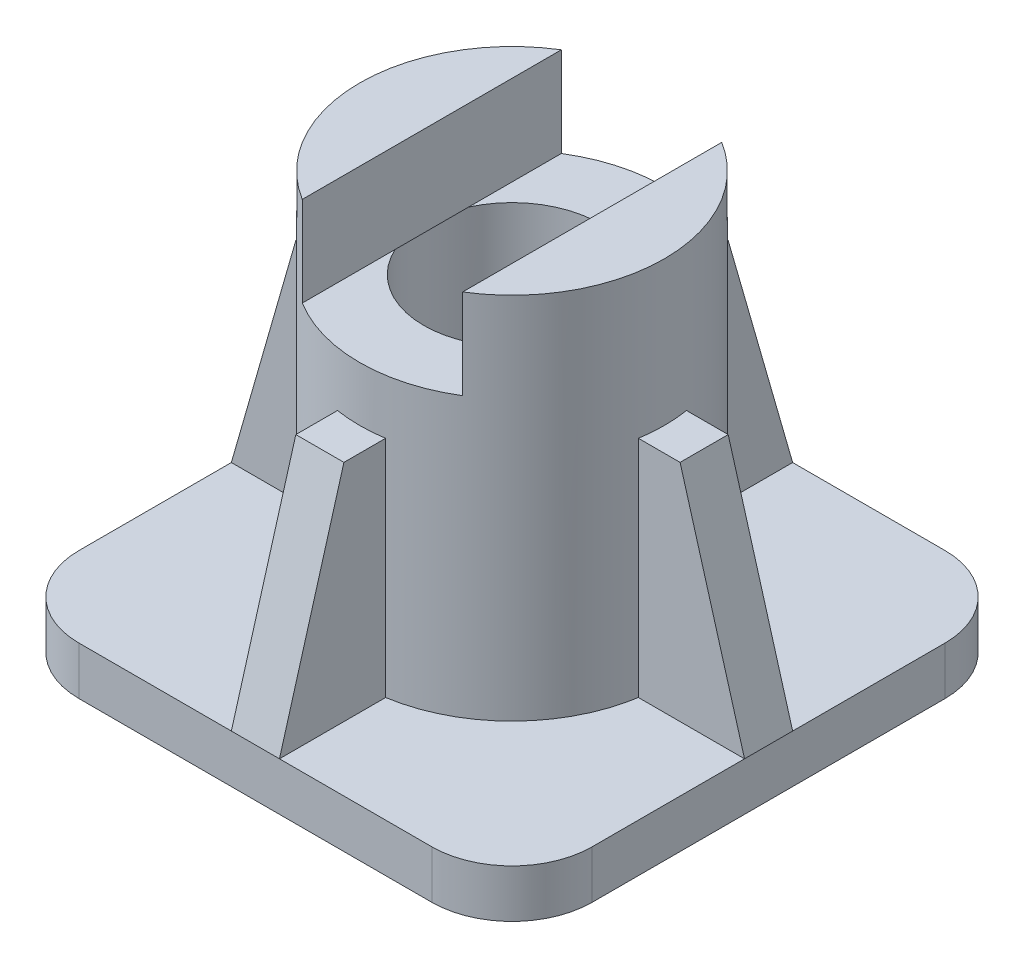
ISO-10303-21;
HEADER;
FILE_DESCRIPTION(('STEP AP214'),'2;1');
FILE_NAME('part.step','',(''),(''),'','','');
FILE_SCHEMA(('AUTOMOTIVE_DESIGN { 1 0 10303 214 1 1 1 1 }'));
ENDSEC;
DATA;
#1=APPLICATION_CONTEXT('core data for automotive mechanical design processes');
#2=APPLICATION_PROTOCOL_DEFINITION('international standard','automotive_design',2000,#1);
#3=PRODUCT_CONTEXT('',#1,'mechanical');
#4=PRODUCT('Part','Part','',(#3));
#5=PRODUCT_RELATED_PRODUCT_CATEGORY('part','',(#4));
#6=PRODUCT_DEFINITION_FORMATION('','',#4);
#7=PRODUCT_DEFINITION_CONTEXT('part definition',#1,'design');
#8=PRODUCT_DEFINITION('design','',#6,#7);
#9=PRODUCT_DEFINITION_SHAPE('','',#8);
#10=(LENGTH_UNIT() NAMED_UNIT(*) SI_UNIT(.MILLI.,.METRE.));
#11=(NAMED_UNIT(*) PLANE_ANGLE_UNIT() SI_UNIT($,.RADIAN.));
#12=(NAMED_UNIT(*) SI_UNIT($,.STERADIAN.) SOLID_ANGLE_UNIT());
#13=UNCERTAINTY_MEASURE_WITH_UNIT(LENGTH_MEASURE(1.E-05),#10,'distance_accuracy_value','');
#14=(GEOMETRIC_REPRESENTATION_CONTEXT(3) GLOBAL_UNCERTAINTY_ASSIGNED_CONTEXT((#13)) GLOBAL_UNIT_ASSIGNED_CONTEXT((#10,
#11,#12)) REPRESENTATION_CONTEXT('',''));
#15=CARTESIAN_POINT('',(0.,0.,0.));
#16=DIRECTION('',(0.,0.,1.));
#17=DIRECTION('',(1.,0.,0.));
#18=AXIS2_PLACEMENT_3D('',#15,#16,#17);
#19=CARTESIAN_POINT('',(80.,85.,-80.));
#20=DIRECTION('',(0.,-1.,0.));
#21=DIRECTION('',(0.,0.,-1.));
#22=AXIS2_PLACEMENT_3D('',#19,#20,#21);
#23=CYLINDRICAL_SURFACE('',#22,47.5);
#24=CARTESIAN_POINT('',(80.,15.,-80.));
#25=DIRECTION('',(0.,1.,0.));
#26=DIRECTION('',(0.,0.,1.));
#27=AXIS2_PLACEMENT_3D('',#24,#25,#26);
#28=CIRCLE('',#27,47.5);
#29=CARTESIAN_POINT('',(126.904157598234,15.,-72.5));
#30=VERTEX_POINT('',#29);
#31=CARTESIAN_POINT('',(126.904157598234,15.,-87.5));
#32=VERTEX_POINT('',#31);
#33=EDGE_CURVE('E88',#30,#32,#28,.T.);
#34=ORIENTED_EDGE('',*,*,#33,.F.);
#35=DIRECTION('',(0.,-1.,0.));
#36=VECTOR('',#35,1.);
#37=CARTESIAN_POINT('',(126.904157598234,85.,-72.5));
#38=LINE('',#37,#36);
#39=CARTESIAN_POINT('',(126.904157598234,85.,-72.5));
#40=VERTEX_POINT('',#39);
#41=EDGE_CURVE('E12',#40,#30,#38,.T.);
#42=ORIENTED_EDGE('',*,*,#41,.F.);
#43=CARTESIAN_POINT('',(80.,85.,-80.));
#44=DIRECTION('',(0.,1.,0.));
#45=DIRECTION('',(0.,0.,1.));
#46=AXIS2_PLACEMENT_3D('',#43,#44,#45);
#47=CIRCLE('',#46,47.5);
#48=CARTESIAN_POINT('',(126.904157598234,85.,-87.5));
#49=VERTEX_POINT('',#48);
#50=EDGE_CURVE('E90',#40,#49,#47,.T.);
#51=ORIENTED_EDGE('',*,*,#50,.T.);
#52=DIRECTION('',(0.,-1.,0.));
#53=VECTOR('',#52,1.);
#54=CARTESIAN_POINT('',(126.904157598234,85.,-87.5));
#55=LINE('',#54,#53);
#56=EDGE_CURVE('E57',#49,#32,#55,.T.);
#57=ORIENTED_EDGE('',*,*,#56,.T.);
#58=EDGE_LOOP('',(#34,#42,#51,#57));
#59=FACE_BOUND('',#58,.T.);
#60=ADVANCED_FACE('F49',(#59),#23,.F.);
#61=CARTESIAN_POINT('',(0.,85.,-72.5000000000001));
#62=DIRECTION('',(0.,0.,1.));
#63=DIRECTION('',(1.,0.,0.));
#64=AXIS2_PLACEMENT_3D('',#61,#62,#63);
#65=PLANE('',#64);
#66=DIRECTION('',(0.275937605338198,-0.961175550022066,0.));
#67=VECTOR('',#66,1.);
#68=CARTESIAN_POINT('',(139.904157598234,85.,-72.5000000000001));
#69=LINE('',#68,#67);
#70=CARTESIAN_POINT('',(139.904157598234,85.,-72.5000000000001));
#71=VERTEX_POINT('',#70);
#72=CARTESIAN_POINT('',(160.,15.,-72.5));
#73=VERTEX_POINT('',#72);
#74=EDGE_CURVE('E79',#71,#73,#69,.T.);
#75=ORIENTED_EDGE('',*,*,#74,.F.);
#76=DIRECTION('',(-1.,0.,0.));
#77=VECTOR('',#76,1.);
#78=CARTESIAN_POINT('',(0.,85.,-72.5000000000001));
#79=LINE('',#78,#77);
#80=EDGE_CURVE('E117',#71,#40,#79,.T.);
#81=ORIENTED_EDGE('',*,*,#80,.T.);
#82=ORIENTED_EDGE('',*,*,#41,.T.);
#83=DIRECTION('',(-1.,0.,0.));
#84=VECTOR('',#83,1.);
#85=CARTESIAN_POINT('',(0.,15.,-72.5000000000001));
#86=LINE('',#85,#84);
#87=EDGE_CURVE('E103',#73,#30,#86,.T.);
#88=ORIENTED_EDGE('',*,*,#87,.F.);
#89=EDGE_LOOP('',(#75,#81,#82,#88));
#90=FACE_BOUND('',#89,.T.);
#91=ADVANCED_FACE('F115',(#90),#65,.T.);
#92=CARTESIAN_POINT('',(0.,85.,-87.5));
#93=DIRECTION('',(0.,0.,1.));
#94=DIRECTION('',(1.,0.,0.));
#95=AXIS2_PLACEMENT_3D('',#92,#93,#94);
#96=PLANE('',#95);
#97=DIRECTION('',(-1.,0.,0.));
#98=VECTOR('',#97,1.);
#99=CARTESIAN_POINT('',(0.,85.,-87.5));
#100=LINE('',#99,#98);
#101=CARTESIAN_POINT('',(139.904157598234,85.,-87.5));
#102=VERTEX_POINT('',#101);
#103=EDGE_CURVE('E65',#102,#49,#100,.T.);
#104=ORIENTED_EDGE('',*,*,#103,.F.);
#105=DIRECTION('',(-0.275937605338198,0.961175550022066,0.));
#106=VECTOR('',#105,1.);
#107=CARTESIAN_POINT('',(139.904157598234,85.,-87.5));
#108=LINE('',#107,#106);
#109=CARTESIAN_POINT('',(160.,15.,-87.5));
#110=VERTEX_POINT('',#109);
#111=EDGE_CURVE('E97',#110,#102,#108,.T.);
#112=ORIENTED_EDGE('',*,*,#111,.F.);
#113=DIRECTION('',(-1.,0.,0.));
#114=VECTOR('',#113,1.);
#115=CARTESIAN_POINT('',(0.,15.,-87.5));
#116=LINE('',#115,#114);
#117=EDGE_CURVE('E94',#110,#32,#116,.T.);
#118=ORIENTED_EDGE('',*,*,#117,.T.);
#119=ORIENTED_EDGE('',*,*,#56,.F.);
#120=EDGE_LOOP('',(#104,#112,#118,#119));
#121=FACE_BOUND('',#120,.T.);
#122=ADVANCED_FACE('F95',(#121),#96,.F.);
#123=CARTESIAN_POINT('',(0.,85.,0.));
#124=DIRECTION('',(0.,1.,0.));
#125=DIRECTION('',(0.,0.,1.));
#126=AXIS2_PLACEMENT_3D('',#123,#124,#125);
#127=PLANE('',#126);
#128=DIRECTION('',(0.,0.,1.));
#129=VECTOR('',#128,1.);
#130=CARTESIAN_POINT('',(139.904157598234,85.,-160.001));
#131=LINE('',#130,#129);
#132=EDGE_CURVE('E106',#102,#71,#131,.T.);
#133=ORIENTED_EDGE('',*,*,#132,.F.);
#134=ORIENTED_EDGE('',*,*,#103,.T.);
#135=ORIENTED_EDGE('',*,*,#50,.F.);
#136=ORIENTED_EDGE('',*,*,#80,.F.);
#137=EDGE_LOOP('',(#133,#134,#135,#136));
#138=FACE_BOUND('',#137,.T.);
#139=ADVANCED_FACE('F118',(#138),#127,.T.);
#140=CARTESIAN_POINT('',(0.,15.,0.));
#141=DIRECTION('',(0.,1.,0.));
#142=DIRECTION('',(0.,0.,1.));
#143=AXIS2_PLACEMENT_3D('',#140,#141,#142);
#144=PLANE('',#143);
#145=ORIENTED_EDGE('',*,*,#33,.T.);
#146=ORIENTED_EDGE('',*,*,#117,.F.);
#147=DIRECTION('',(0.,0.,-1.));
#148=VECTOR('',#147,1.);
#149=CARTESIAN_POINT('',(160.,15.,0.));
#150=LINE('',#149,#148);
#151=EDGE_CURVE('E99',#73,#110,#150,.T.);
#152=ORIENTED_EDGE('',*,*,#151,.F.);
#153=ORIENTED_EDGE('',*,*,#87,.T.);
#154=EDGE_LOOP('',(#145,#146,#152,#153));
#155=FACE_BOUND('',#154,.T.);
#156=ADVANCED_FACE('F101',(#155),#144,.F.);
#157=CARTESIAN_POINT('',(139.904157598234,85.,-160.001));
#158=DIRECTION('',(-0.961175550022066,-0.275937605338198,0.));
#159=DIRECTION('',(0.275937605338198,-0.961175550022066,0.));
#160=AXIS2_PLACEMENT_3D('',#157,#158,#159);
#161=PLANE('',#160);
#162=ORIENTED_EDGE('',*,*,#111,.T.);
#163=ORIENTED_EDGE('',*,*,#132,.T.);
#164=ORIENTED_EDGE('',*,*,#74,.T.);
#165=ORIENTED_EDGE('',*,*,#151,.T.);
#166=EDGE_LOOP('',(#162,#163,#164,#165));
#167=FACE_BOUND('',#166,.T.);
#168=ADVANCED_FACE('F111',(#167),#161,.F.);
#169=CLOSED_SHELL('',(#60,#91,#122,#139,#156,#168));
#170=MANIFOLD_SOLID_BREP('B2',#169);
#171=CARTESIAN_POINT('',(55.0000000000007,102.,-160.));
#172=DIRECTION('',(0.,-1.,0.));
#173=DIRECTION('',(0.,0.,-1.));
#174=AXIS2_PLACEMENT_3D('',#171,#172,#173);
#175=PLANE('',#174);
#176=CARTESIAN_POINT('',(80.,102.,-80.));
#177=DIRECTION('',(0.,1.,0.));
#178=DIRECTION('',(0.,0.,1.));
#179=AXIS2_PLACEMENT_3D('',#176,#177,#178);
#180=CIRCLE('',#179,27.5);
#181=CARTESIAN_POINT('',(105.000000000001,102.,-91.4564392373881));
#182=VERTEX_POINT('',#181);
#183=CARTESIAN_POINT('',(55.0000000000007,102.,-91.456439237391));
#184=VERTEX_POINT('',#183);
#185=EDGE_CURVE('E363',#182,#184,#180,.T.);
#186=ORIENTED_EDGE('',*,*,#185,.F.);
#187=DIRECTION('',(0.,0.,1.));
#188=VECTOR('',#187,1.);
#189=CARTESIAN_POINT('',(105.000000000001,102.,-160.));
#190=LINE('',#189,#188);
#191=CARTESIAN_POINT('',(105.000000000001,102.,-120.388736053508));
#192=VERTEX_POINT('',#191);
#193=EDGE_CURVE('E373',#192,#182,#190,.T.);
#194=ORIENTED_EDGE('',*,*,#193,.F.);
#195=CARTESIAN_POINT('',(80.,102.,-80.));
#196=DIRECTION('',(0.,-1.,0.));
#197=DIRECTION('',(0.,0.,-1.));
#198=AXIS2_PLACEMENT_3D('',#195,#196,#197);
#199=CIRCLE('',#198,47.5);
#200=CARTESIAN_POINT('',(55.0000000000007,102.,-120.388736053509));
#201=VERTEX_POINT('',#200);
#202=EDGE_CURVE('E519',#201,#192,#199,.T.);
#203=ORIENTED_EDGE('',*,*,#202,.F.);
#204=DIRECTION('',(0.,0.,1.));
#205=VECTOR('',#204,1.);
#206=CARTESIAN_POINT('',(55.0000000000007,102.,-160.));
#207=LINE('',#206,#205);
#208=EDGE_CURVE('E371',#201,#184,#207,.T.);
#209=ORIENTED_EDGE('',*,*,#208,.T.);
#210=EDGE_LOOP('',(#186,#194,#203,#209));
#211=FACE_BOUND('',#210,.T.);
#212=ADVANCED_FACE('F173',(#211),#175,.F.);
#213=CARTESIAN_POINT('',(55.0000000000007,102.,-68.543560762609));
#214=VERTEX_POINT('',#213);
#215=CARTESIAN_POINT('',(105.000000000001,102.,-68.5435607626119));
#216=VERTEX_POINT('',#215);
#217=EDGE_CURVE('E346',#214,#216,#180,.T.);
#218=ORIENTED_EDGE('',*,*,#217,.F.);
#219=CARTESIAN_POINT('',(55.0000000000007,102.,-39.6112639464908));
#220=VERTEX_POINT('',#219);
#221=EDGE_CURVE('E383',#214,#220,#207,.T.);
#222=ORIENTED_EDGE('',*,*,#221,.T.);
#223=CARTESIAN_POINT('',(105.000000000001,102.,-39.6112639464916));
#224=VERTEX_POINT('',#223);
#225=EDGE_CURVE('E368',#224,#220,#199,.T.);
#226=ORIENTED_EDGE('',*,*,#225,.F.);
#227=EDGE_CURVE('E365',#216,#224,#190,.T.);
#228=ORIENTED_EDGE('',*,*,#227,.F.);
#229=EDGE_LOOP('',(#218,#222,#226,#228));
#230=FACE_BOUND('',#229,.T.);
#231=ADVANCED_FACE('F366',(#230),#175,.F.);
#232=CARTESIAN_POINT('',(0.,130.,0.));
#233=DIRECTION('',(0.,1.,0.));
#234=DIRECTION('',(0.,0.,1.));
#235=AXIS2_PLACEMENT_3D('',#232,#233,#234);
#236=PLANE('',#235);
#237=DIRECTION('',(0.,0.,1.));
#238=VECTOR('',#237,1.);
#239=CARTESIAN_POINT('',(55.0000000000007,130.,0.));
#240=LINE('',#239,#238);
#241=CARTESIAN_POINT('',(55.0000000000007,130.,-120.388736053509));
#242=VERTEX_POINT('',#241);
#243=CARTESIAN_POINT('',(55.0000000000007,130.,-39.6112639464908));
#244=VERTEX_POINT('',#243);
#245=EDGE_CURVE('E517',#242,#244,#240,.T.);
#246=ORIENTED_EDGE('',*,*,#245,.F.);
#247=CARTESIAN_POINT('',(80.,130.,-80.));
#248=DIRECTION('',(0.,1.,0.));
#249=DIRECTION('',(0.,0.,1.));
#250=AXIS2_PLACEMENT_3D('',#247,#248,#249);
#251=CIRCLE('',#250,47.5);
#252=EDGE_CURVE('E482',#242,#244,#251,.T.);
#253=ORIENTED_EDGE('',*,*,#252,.T.);
#254=EDGE_LOOP('',(#246,#253));
#255=FACE_BOUND('',#254,.T.);
#256=ADVANCED_FACE('F634',(#255),#236,.T.);
#257=CARTESIAN_POINT('',(0.,15.,0.));
#258=DIRECTION('',(0.,1.,0.));
#259=DIRECTION('',(0.,0.,1.));
#260=AXIS2_PLACEMENT_3D('',#257,#258,#259);
#261=PLANE('',#260);
#262=DIRECTION('',(0.,0.,-1.));
#263=VECTOR('',#262,1.);
#264=CARTESIAN_POINT('',(160.,15.,0.));
#265=LINE('',#264,#263);
#266=CARTESIAN_POINT('',(160.,15.,-25.));
#267=VERTEX_POINT('',#266);
#268=CARTESIAN_POINT('',(160.,15.,-135.));
#269=VERTEX_POINT('',#268);
#270=EDGE_CURVE('E495',#267,#269,#265,.T.);
#271=ORIENTED_EDGE('',*,*,#270,.T.);
#272=CARTESIAN_POINT('',(135.,15.,-135.));
#273=DIRECTION('',(0.,1.,0.));
#274=DIRECTION('',(0.,0.,1.));
#275=AXIS2_PLACEMENT_3D('',#272,#273,#274);
#276=CIRCLE('',#275,25.);
#277=CARTESIAN_POINT('',(135.,15.,-160.));
#278=VERTEX_POINT('',#277);
#279=EDGE_CURVE('E542',#269,#278,#276,.T.);
#280=ORIENTED_EDGE('',*,*,#279,.T.);
#281=DIRECTION('',(1.,0.,0.));
#282=VECTOR('',#281,1.);
#283=CARTESIAN_POINT('',(0.,15.,-160.));
#284=LINE('',#283,#282);
#285=CARTESIAN_POINT('',(87.4999999999998,15.,-160.));
#286=VERTEX_POINT('',#285);
#287=EDGE_CURVE('E499',#286,#278,#284,.T.);
#288=ORIENTED_EDGE('',*,*,#287,.F.);
#289=DIRECTION('',(0.,0.,1.));
#290=VECTOR('',#289,1.);
#291=CARTESIAN_POINT('',(87.5000000000002,15.,0.));
#292=LINE('',#291,#290);
#293=CARTESIAN_POINT('',(87.4999999999998,15.,-126.904157598234));
#294=VERTEX_POINT('',#293);
#295=EDGE_CURVE('E458',#286,#294,#292,.T.);
#296=ORIENTED_EDGE('',*,*,#295,.T.);
#297=CARTESIAN_POINT('',(80.,15.,-80.));
#298=DIRECTION('',(0.,1.,0.));
#299=DIRECTION('',(0.,0.,1.));
#300=AXIS2_PLACEMENT_3D('',#297,#298,#299);
#301=CIRCLE('',#300,47.5);
#302=CARTESIAN_POINT('',(87.5000000000005,15.,-33.0958424017658));
#303=VERTEX_POINT('',#302);
#304=EDGE_CURVE('E492',#303,#294,#301,.T.);
#305=ORIENTED_EDGE('',*,*,#304,.F.);
#306=DIRECTION('',(0.,0.,-1.));
#307=VECTOR('',#306,1.);
#308=CARTESIAN_POINT('',(87.4999999999991,15.,-160.));
#309=LINE('',#308,#307);
#310=CARTESIAN_POINT('',(87.5000000000009,15.,0.));
#311=VERTEX_POINT('',#310);
#312=EDGE_CURVE('E397',#311,#303,#309,.T.);
#313=ORIENTED_EDGE('',*,*,#312,.F.);
#314=DIRECTION('',(1.,0.,0.));
#315=VECTOR('',#314,1.);
#316=CARTESIAN_POINT('',(0.,15.,0.));
#317=LINE('',#316,#315);
#318=CARTESIAN_POINT('',(135.,15.,0.));
#319=VERTEX_POINT('',#318);
#320=EDGE_CURVE('E496',#311,#319,#317,.T.);
#321=ORIENTED_EDGE('',*,*,#320,.T.);
#322=CARTESIAN_POINT('',(135.,15.,-25.));
#323=DIRECTION('',(0.,1.,0.));
#324=DIRECTION('',(0.,0.,1.));
#325=AXIS2_PLACEMENT_3D('',#322,#323,#324);
#326=CIRCLE('',#325,25.);
#327=EDGE_CURVE('E540',#319,#267,#326,.T.);
#328=ORIENTED_EDGE('',*,*,#327,.T.);
#329=EDGE_LOOP('',(#271,#280,#288,#296,#305,#313,#321,#328));
#330=FACE_BOUND('',#329,.T.);
#331=ADVANCED_FACE('F611',(#330),#261,.T.);
#332=DIRECTION('',(0.,0.,-1.));
#333=VECTOR('',#332,1.);
#334=CARTESIAN_POINT('',(0.,15.,0.));
#335=LINE('',#334,#333);
#336=CARTESIAN_POINT('',(0.,15.,-25.));
#337=VERTEX_POINT('',#336);
#338=CARTESIAN_POINT('',(0.,15.,-72.5));
#339=VERTEX_POINT('',#338);
#340=EDGE_CURVE('E503',#337,#339,#335,.T.);
#341=ORIENTED_EDGE('',*,*,#340,.F.);
#342=CARTESIAN_POINT('',(25.,15.,-25.));
#343=DIRECTION('',(0.,1.,0.));
#344=DIRECTION('',(0.,0.,1.));
#345=AXIS2_PLACEMENT_3D('',#342,#343,#344);
#346=CIRCLE('',#345,25.);
#347=CARTESIAN_POINT('',(25.,15.,0.));
#348=VERTEX_POINT('',#347);
#349=EDGE_CURVE('E47',#337,#348,#346,.T.);
#350=ORIENTED_EDGE('',*,*,#349,.T.);
#351=CARTESIAN_POINT('',(72.5000000000005,15.,0.));
#352=VERTEX_POINT('',#351);
#353=EDGE_CURVE('E493',#348,#352,#317,.T.);
#354=ORIENTED_EDGE('',*,*,#353,.T.);
#355=DIRECTION('',(0.,0.,-1.));
#356=VECTOR('',#355,1.);
#357=CARTESIAN_POINT('',(72.4999999999992,15.,-160.));
#358=LINE('',#357,#356);
#359=CARTESIAN_POINT('',(72.5000000000005,15.,-33.0958424017656));
#360=VERTEX_POINT('',#359);
#361=EDGE_CURVE('E400',#352,#360,#358,.T.);
#362=ORIENTED_EDGE('',*,*,#361,.T.);
#363=CARTESIAN_POINT('',(33.0958424017657,15.,-72.5));
#364=VERTEX_POINT('',#363);
#365=EDGE_CURVE('E491',#364,#360,#301,.T.);
#366=ORIENTED_EDGE('',*,*,#365,.F.);
#367=DIRECTION('',(1.,0.,0.));
#368=VECTOR('',#367,1.);
#369=CARTESIAN_POINT('',(160.,15.,-72.5000000000001));
#370=LINE('',#369,#368);
#371=EDGE_CURVE('E426',#339,#364,#370,.T.);
#372=ORIENTED_EDGE('',*,*,#371,.F.);
#373=EDGE_LOOP('',(#341,#350,#354,#362,#366,#372));
#374=FACE_BOUND('',#373,.T.);
#375=ADVANCED_FACE('F571',(#374),#261,.T.);
#376=CARTESIAN_POINT('',(0.,15.,0.));
#377=DIRECTION('',(0.,0.,-1.));
#378=DIRECTION('',(-1.,0.,0.));
#379=AXIS2_PLACEMENT_3D('',#376,#377,#378);
#380=PLANE('',#379);
#381=DIRECTION('',(1.,0.,0.));
#382=VECTOR('',#381,1.);
#383=CARTESIAN_POINT('',(0.,0.,0.));
#384=LINE('',#383,#382);
#385=CARTESIAN_POINT('',(25.,0.,0.));
#386=VERTEX_POINT('',#385);
#387=CARTESIAN_POINT('',(135.,0.,0.));
#388=VERTEX_POINT('',#387);
#389=EDGE_CURVE('E486',#386,#388,#384,.T.);
#390=ORIENTED_EDGE('',*,*,#389,.T.);
#391=DIRECTION('',(0.,-1.,0.));
#392=VECTOR('',#391,1.);
#393=CARTESIAN_POINT('',(135.,15.,0.));
#394=LINE('',#393,#392);
#395=EDGE_CURVE('E547',#388,#319,#394,.F.);
#396=ORIENTED_EDGE('',*,*,#395,.T.);
#397=ORIENTED_EDGE('',*,*,#320,.F.);
#398=DIRECTION('',(1.,0.,0.));
#399=VECTOR('',#398,1.);
#400=CARTESIAN_POINT('',(8.43243774175837E-13,15.,8.32667268468867E-13));
#401=LINE('',#400,#399);
#402=EDGE_CURVE('E394',#352,#311,#401,.T.);
#403=ORIENTED_EDGE('',*,*,#402,.F.);
#404=ORIENTED_EDGE('',*,*,#353,.F.);
#405=DIRECTION('',(0.,-1.,0.));
#406=VECTOR('',#405,1.);
#407=CARTESIAN_POINT('',(25.,0.,0.));
#408=LINE('',#407,#406);
#409=EDGE_CURVE('E544',#348,#386,#408,.T.);
#410=ORIENTED_EDGE('',*,*,#409,.T.);
#411=EDGE_LOOP('',(#390,#396,#397,#403,#404,#410));
#412=FACE_BOUND('',#411,.T.);
#413=ADVANCED_FACE('F565',(#412),#380,.F.);
#414=CARTESIAN_POINT('',(160.,15.,0.));
#415=DIRECTION('',(-1.,0.,0.));
#416=DIRECTION('',(0.,0.,1.));
#417=AXIS2_PLACEMENT_3D('',#414,#415,#416);
#418=PLANE('',#417);
#419=DIRECTION('',(0.,0.,-1.));
#420=VECTOR('',#419,1.);
#421=CARTESIAN_POINT('',(160.,0.,0.));
#422=LINE('',#421,#420);
#423=CARTESIAN_POINT('',(160.,0.,-25.));
#424=VERTEX_POINT('',#423);
#425=CARTESIAN_POINT('',(160.,0.,-135.));
#426=VERTEX_POINT('',#425);
#427=EDGE_CURVE('E507',#424,#426,#422,.T.);
#428=ORIENTED_EDGE('',*,*,#427,.T.);
#429=DIRECTION('',(0.,-1.,0.));
#430=VECTOR('',#429,1.);
#431=CARTESIAN_POINT('',(160.,15.,-135.));
#432=LINE('',#431,#430);
#433=EDGE_CURVE('E538',#426,#269,#432,.F.);
#434=ORIENTED_EDGE('',*,*,#433,.T.);
#435=ORIENTED_EDGE('',*,*,#270,.F.);
#436=DIRECTION('',(0.,-1.,0.));
#437=VECTOR('',#436,1.);
#438=CARTESIAN_POINT('',(160.,15.,-25.));
#439=LINE('',#438,#437);
#440=EDGE_CURVE('E535',#267,#424,#439,.T.);
#441=ORIENTED_EDGE('',*,*,#440,.T.);
#442=EDGE_LOOP('',(#428,#434,#435,#441));
#443=FACE_BOUND('',#442,.T.);
#444=ADVANCED_FACE('F692',(#443),#418,.F.);
#445=CARTESIAN_POINT('',(0.,15.,-160.));
#446=DIRECTION('',(0.,0.,-1.));
#447=DIRECTION('',(-1.,0.,0.));
#448=AXIS2_PLACEMENT_3D('',#445,#446,#447);
#449=PLANE('',#448);
#450=ORIENTED_EDGE('',*,*,#287,.T.);
#451=DIRECTION('',(0.,-1.,0.));
#452=VECTOR('',#451,1.);
#453=CARTESIAN_POINT('',(135.,0.,-160.));
#454=LINE('',#453,#452);
#455=CARTESIAN_POINT('',(135.,0.,-160.));
#456=VERTEX_POINT('',#455);
#457=EDGE_CURVE('E524',#278,#456,#454,.T.);
#458=ORIENTED_EDGE('',*,*,#457,.T.);
#459=DIRECTION('',(1.,0.,0.));
#460=VECTOR('',#459,1.);
#461=CARTESIAN_POINT('',(0.,0.,-160.));
#462=LINE('',#461,#460);
#463=CARTESIAN_POINT('',(25.,0.,-160.));
#464=VERTEX_POINT('',#463);
#465=EDGE_CURVE('E510',#464,#456,#462,.T.);
#466=ORIENTED_EDGE('',*,*,#465,.F.);
#467=DIRECTION('',(0.,-1.,0.));
#468=VECTOR('',#467,1.);
#469=CARTESIAN_POINT('',(25.,15.,-160.));
#470=LINE('',#469,#468);
#471=CARTESIAN_POINT('',(25.,15.,-160.));
#472=VERTEX_POINT('',#471);
#473=EDGE_CURVE('E522',#464,#472,#470,.F.);
#474=ORIENTED_EDGE('',*,*,#473,.T.);
#475=CARTESIAN_POINT('',(72.4999999999998,15.,-160.));
#476=VERTEX_POINT('',#475);
#477=EDGE_CURVE('E500',#472,#476,#284,.T.);
#478=ORIENTED_EDGE('',*,*,#477,.T.);
#479=DIRECTION('',(-1.,0.,0.));
#480=VECTOR('',#479,1.);
#481=CARTESIAN_POINT('',(160.,15.,-160.));
#482=LINE('',#481,#480);
#483=EDGE_CURVE('E452',#286,#476,#482,.T.);
#484=ORIENTED_EDGE('',*,*,#483,.F.);
#485=EDGE_LOOP('',(#450,#458,#466,#474,#478,#484));
#486=FACE_BOUND('',#485,.T.);
#487=ADVANCED_FACE('F616',(#486),#449,.T.);
#488=CARTESIAN_POINT('',(0.,15.,0.));
#489=DIRECTION('',(-1.,0.,0.));
#490=DIRECTION('',(0.,0.,1.));
#491=AXIS2_PLACEMENT_3D('',#488,#489,#490);
#492=PLANE('',#491);
#493=CARTESIAN_POINT('',(0.,15.,-87.5));
#494=VERTEX_POINT('',#493);
#495=CARTESIAN_POINT('',(0.,15.,-135.));
#496=VERTEX_POINT('',#495);
#497=EDGE_CURVE('E502',#494,#496,#335,.T.);
#498=ORIENTED_EDGE('',*,*,#497,.T.);
#499=DIRECTION('',(0.,-1.,0.));
#500=VECTOR('',#499,1.);
#501=CARTESIAN_POINT('',(0.,15.,-135.));
#502=LINE('',#501,#500);
#503=CARTESIAN_POINT('',(0.,0.,-135.));
#504=VERTEX_POINT('',#503);
#505=EDGE_CURVE('E550',#496,#504,#502,.T.);
#506=ORIENTED_EDGE('',*,*,#505,.T.);
#507=DIRECTION('',(0.,0.,-1.));
#508=VECTOR('',#507,1.);
#509=CARTESIAN_POINT('',(0.,0.,0.));
#510=LINE('',#509,#508);
#511=CARTESIAN_POINT('',(0.,0.,-25.));
#512=VERTEX_POINT('',#511);
#513=EDGE_CURVE('E513',#512,#504,#510,.T.);
#514=ORIENTED_EDGE('',*,*,#513,.F.);
#515=DIRECTION('',(0.,-1.,0.));
#516=VECTOR('',#515,1.);
#517=CARTESIAN_POINT('',(0.,15.,-25.));
#518=LINE('',#517,#516);
#519=EDGE_CURVE('E195',#512,#337,#518,.F.);
#520=ORIENTED_EDGE('',*,*,#519,.T.);
#521=ORIENTED_EDGE('',*,*,#340,.T.);
#522=DIRECTION('',(0.,0.,1.));
#523=VECTOR('',#522,1.);
#524=CARTESIAN_POINT('',(0.,15.,-160.));
#525=LINE('',#524,#523);
#526=EDGE_CURVE('E423',#494,#339,#525,.T.);
#527=ORIENTED_EDGE('',*,*,#526,.F.);
#528=EDGE_LOOP('',(#498,#506,#514,#520,#521,#527));
#529=FACE_BOUND('',#528,.T.);
#530=ADVANCED_FACE('F553',(#529),#492,.T.);
#531=ORIENTED_EDGE('',*,*,#477,.F.);
#532=CARTESIAN_POINT('',(25.,15.,-135.));
#533=DIRECTION('',(0.,1.,0.));
#534=DIRECTION('',(0.,0.,1.));
#535=AXIS2_PLACEMENT_3D('',#532,#533,#534);
#536=CIRCLE('',#535,25.);
#537=EDGE_CURVE('E181',#472,#496,#536,.T.);
#538=ORIENTED_EDGE('',*,*,#537,.T.);
#539=ORIENTED_EDGE('',*,*,#497,.F.);
#540=DIRECTION('',(1.,0.,0.));
#541=VECTOR('',#540,1.);
#542=CARTESIAN_POINT('',(160.,15.,-87.5));
#543=LINE('',#542,#541);
#544=CARTESIAN_POINT('',(33.0958424017657,15.,-87.5));
#545=VERTEX_POINT('',#544);
#546=EDGE_CURVE('E429',#494,#545,#543,.T.);
#547=ORIENTED_EDGE('',*,*,#546,.T.);
#548=CARTESIAN_POINT('',(72.4999999999998,15.,-126.904157598234));
#549=VERTEX_POINT('',#548);
#550=EDGE_CURVE('E487',#549,#545,#301,.T.);
#551=ORIENTED_EDGE('',*,*,#550,.F.);
#552=DIRECTION('',(0.,0.,1.));
#553=VECTOR('',#552,1.);
#554=CARTESIAN_POINT('',(72.5000000000003,15.,0.));
#555=LINE('',#554,#553);
#556=EDGE_CURVE('E455',#476,#549,#555,.T.);
#557=ORIENTED_EDGE('',*,*,#556,.F.);
#558=EDGE_LOOP('',(#531,#538,#539,#547,#551,#557));
#559=FACE_BOUND('',#558,.T.);
#560=ADVANCED_FACE('F593',(#559),#261,.T.);
#561=CARTESIAN_POINT('',(0.,0.,0.));
#562=DIRECTION('',(0.,1.,0.));
#563=DIRECTION('',(0.,0.,1.));
#564=AXIS2_PLACEMENT_3D('',#561,#562,#563);
#565=PLANE('',#564);
#566=CARTESIAN_POINT('',(80.,0.,-80.));
#567=DIRECTION('',(0.,1.,0.));
#568=DIRECTION('',(0.,0.,1.));
#569=AXIS2_PLACEMENT_3D('',#566,#567,#568);
#570=CIRCLE('',#569,27.5);
#571=CARTESIAN_POINT('',(80.,0.,-52.5));
#572=VERTEX_POINT('',#571);
#573=EDGE_CURVE('E362',#572,#572,#570,.T.);
#574=ORIENTED_EDGE('',*,*,#573,.T.);
#575=EDGE_LOOP('',(#574));
#576=FACE_BOUND('',#575,.T.);
#577=ORIENTED_EDGE('',*,*,#465,.T.);
#578=CARTESIAN_POINT('',(135.,0.,-135.));
#579=DIRECTION('',(0.,1.,0.));
#580=DIRECTION('',(0.,0.,1.));
#581=AXIS2_PLACEMENT_3D('',#578,#579,#580);
#582=CIRCLE('',#581,25.);
#583=EDGE_CURVE('E533',#456,#426,#582,.F.);
#584=ORIENTED_EDGE('',*,*,#583,.T.);
#585=ORIENTED_EDGE('',*,*,#427,.F.);
#586=CARTESIAN_POINT('',(135.,0.,-25.));
#587=DIRECTION('',(0.,1.,0.));
#588=DIRECTION('',(0.,0.,1.));
#589=AXIS2_PLACEMENT_3D('',#586,#587,#588);
#590=CIRCLE('',#589,25.);
#591=EDGE_CURVE('E531',#424,#388,#590,.F.);
#592=ORIENTED_EDGE('',*,*,#591,.T.);
#593=ORIENTED_EDGE('',*,*,#389,.F.);
#594=CARTESIAN_POINT('',(25.,0.,-25.));
#595=DIRECTION('',(0.,1.,0.));
#596=DIRECTION('',(0.,0.,1.));
#597=AXIS2_PLACEMENT_3D('',#594,#595,#596);
#598=CIRCLE('',#597,25.);
#599=EDGE_CURVE('E527',#386,#512,#598,.F.);
#600=ORIENTED_EDGE('',*,*,#599,.T.);
#601=ORIENTED_EDGE('',*,*,#513,.T.);
#602=CARTESIAN_POINT('',(25.,0.,-135.));
#603=DIRECTION('',(0.,1.,0.));
#604=DIRECTION('',(0.,0.,1.));
#605=AXIS2_PLACEMENT_3D('',#602,#603,#604);
#606=CIRCLE('',#605,25.);
#607=EDGE_CURVE('E529',#504,#464,#606,.F.);
#608=ORIENTED_EDGE('',*,*,#607,.T.);
#609=EDGE_LOOP('',(#577,#584,#585,#592,#593,#600,#601,#608));
#610=FACE_BOUND('',#609,.T.);
#611=ADVANCED_FACE('F557',(#576,#610),#565,.F.);
#612=CARTESIAN_POINT('',(80.,130.,-80.));
#613=DIRECTION('',(0.,-1.,0.));
#614=DIRECTION('',(0.,0.,-1.));
#615=AXIS2_PLACEMENT_3D('',#612,#613,#614);
#616=CYLINDRICAL_SURFACE('',#615,47.5);
#617=ORIENTED_EDGE('',*,*,#225,.T.);
#618=DIRECTION('',(0.,-1.,0.));
#619=VECTOR('',#618,1.);
#620=CARTESIAN_POINT('',(55.0000000000007,130.,-39.6112639464908));
#621=LINE('',#620,#619);
#622=EDGE_CURVE('E388',#220,#244,#621,.F.);
#623=ORIENTED_EDGE('',*,*,#622,.T.);
#624=ORIENTED_EDGE('',*,*,#252,.F.);
#625=DIRECTION('',(0.,-1.,0.));
#626=VECTOR('',#625,1.);
#627=CARTESIAN_POINT('',(55.0000000000007,130.,-120.388736053509));
#628=LINE('',#627,#626);
#629=EDGE_CURVE('E391',#242,#201,#628,.T.);
#630=ORIENTED_EDGE('',*,*,#629,.T.);
#631=ORIENTED_EDGE('',*,*,#202,.T.);
#632=DIRECTION('',(0.,-1.,0.));
#633=VECTOR('',#632,1.);
#634=CARTESIAN_POINT('',(105.000000000001,130.,-120.388736053508));
#635=LINE('',#634,#633);
#636=CARTESIAN_POINT('',(105.000000000001,130.,-120.388736053508));
#637=VERTEX_POINT('',#636);
#638=EDGE_CURVE('E377',#192,#637,#635,.F.);
#639=ORIENTED_EDGE('',*,*,#638,.T.);
#640=CARTESIAN_POINT('',(105.000000000001,130.,-39.6112639464916));
#641=VERTEX_POINT('',#640);
#642=EDGE_CURVE('E483',#641,#637,#251,.T.);
#643=ORIENTED_EDGE('',*,*,#642,.F.);
#644=DIRECTION('',(0.,-1.,0.));
#645=VECTOR('',#644,1.);
#646=CARTESIAN_POINT('',(105.000000000001,130.,-39.6112639464916));
#647=LINE('',#646,#645);
#648=EDGE_CURVE('E386',#641,#224,#647,.T.);
#649=ORIENTED_EDGE('',*,*,#648,.T.);
#650=EDGE_LOOP('',(#617,#623,#624,#630,#631,#639,#643,#649));
#651=FACE_BOUND('',#650,.T.);
#652=ORIENTED_EDGE('',*,*,#365,.T.);
#653=DIRECTION('',(0.,-1.,0.));
#654=VECTOR('',#653,1.);
#655=CARTESIAN_POINT('',(72.5000000000005,85.,-33.0958424017656));
#656=LINE('',#655,#654);
#657=CARTESIAN_POINT('',(72.5000000000005,85.,-33.0958424017656));
#658=VERTEX_POINT('',#657);
#659=EDGE_CURVE('E420',#658,#360,#656,.T.);
#660=ORIENTED_EDGE('',*,*,#659,.F.);
#661=CARTESIAN_POINT('',(80.,85.,-80.));
#662=DIRECTION('',(0.,1.,0.));
#663=DIRECTION('',(-1.,0.,0.));
#664=AXIS2_PLACEMENT_3D('',#661,#662,#663);
#665=CIRCLE('',#664,47.5);
#666=CARTESIAN_POINT('',(87.5000000000005,85.,-33.0958424017658));
#667=VERTEX_POINT('',#666);
#668=EDGE_CURVE('E412',#658,#667,#665,.T.);
#669=ORIENTED_EDGE('',*,*,#668,.T.);
#670=DIRECTION('',(0.,-1.,0.));
#671=VECTOR('',#670,1.);
#672=CARTESIAN_POINT('',(87.5000000000005,85.,-33.0958424017658));
#673=LINE('',#672,#671);
#674=EDGE_CURVE('E408',#667,#303,#673,.T.);
#675=ORIENTED_EDGE('',*,*,#674,.T.);
#676=ORIENTED_EDGE('',*,*,#304,.T.);
#677=DIRECTION('',(0.,-1.,0.));
#678=VECTOR('',#677,1.);
#679=CARTESIAN_POINT('',(87.4999999999998,85.,-126.904157598234));
#680=LINE('',#679,#678);
#681=CARTESIAN_POINT('',(87.4999999999998,85.,-126.904157598234));
#682=VERTEX_POINT('',#681);
#683=EDGE_CURVE('E479',#682,#294,#680,.T.);
#684=ORIENTED_EDGE('',*,*,#683,.F.);
#685=CARTESIAN_POINT('',(80.,85.,-80.));
#686=DIRECTION('',(0.,1.,0.));
#687=DIRECTION('',(1.,0.,0.));
#688=AXIS2_PLACEMENT_3D('',#685,#686,#687);
#689=CIRCLE('',#688,47.5);
#690=CARTESIAN_POINT('',(72.4999999999998,85.,-126.904157598234));
#691=VERTEX_POINT('',#690);
#692=EDGE_CURVE('E471',#682,#691,#689,.T.);
#693=ORIENTED_EDGE('',*,*,#692,.T.);
#694=DIRECTION('',(0.,-1.,0.));
#695=VECTOR('',#694,1.);
#696=CARTESIAN_POINT('',(72.4999999999998,85.,-126.904157598234));
#697=LINE('',#696,#695);
#698=EDGE_CURVE('E467',#691,#549,#697,.T.);
#699=ORIENTED_EDGE('',*,*,#698,.T.);
#700=ORIENTED_EDGE('',*,*,#550,.T.);
#701=DIRECTION('',(0.,-1.,0.));
#702=VECTOR('',#701,1.);
#703=CARTESIAN_POINT('',(33.0958424017657,85.,-87.5));
#704=LINE('',#703,#702);
#705=CARTESIAN_POINT('',(33.0958424017657,85.,-87.5));
#706=VERTEX_POINT('',#705);
#707=EDGE_CURVE('E449',#706,#545,#704,.T.);
#708=ORIENTED_EDGE('',*,*,#707,.F.);
#709=CARTESIAN_POINT('',(80.,85.,-80.));
#710=DIRECTION('',(0.,1.,0.));
#711=DIRECTION('',(0.,0.,-1.));
#712=AXIS2_PLACEMENT_3D('',#709,#710,#711);
#713=CIRCLE('',#712,47.5);
#714=CARTESIAN_POINT('',(33.0958424017657,85.,-72.5));
#715=VERTEX_POINT('',#714);
#716=EDGE_CURVE('E441',#706,#715,#713,.T.);
#717=ORIENTED_EDGE('',*,*,#716,.T.);
#718=DIRECTION('',(0.,-1.,0.));
#719=VECTOR('',#718,1.);
#720=CARTESIAN_POINT('',(33.0958424017657,85.,-72.5));
#721=LINE('',#720,#719);
#722=EDGE_CURVE('E437',#715,#364,#721,.T.);
#723=ORIENTED_EDGE('',*,*,#722,.T.);
#724=EDGE_LOOP('',(#652,#660,#669,#675,#676,#684,#693,#699,#700,#708,#717,#723));
#725=FACE_BOUND('',#724,.T.);
#726=ADVANCED_FACE('F590',(#651,#725),#616,.T.);
#727=DIRECTION('',(0.,0.,-1.));
#728=VECTOR('',#727,1.);
#729=CARTESIAN_POINT('',(105.000000000001,130.,0.));
#730=LINE('',#729,#728);
#731=EDGE_CURVE('E490',#641,#637,#730,.T.);
#732=ORIENTED_EDGE('',*,*,#731,.F.);
#733=ORIENTED_EDGE('',*,*,#642,.T.);
#734=EDGE_LOOP('',(#732,#733));
#735=FACE_BOUND('',#734,.T.);
#736=ADVANCED_FACE('F676',(#735),#236,.T.);
#737=CARTESIAN_POINT('',(160.,43.578040163831,-151.795717267376));
#738=DIRECTION('',(0.,0.275937605338198,-0.961175550022066));
#739=DIRECTION('',(0.,0.961175550022066,0.275937605338198));
#740=AXIS2_PLACEMENT_3D('',#737,#738,#739);
#741=PLANE('',#740);
#742=DIRECTION('',(0.,-0.961175550022066,-0.275937605338198));
#743=VECTOR('',#742,1.);
#744=CARTESIAN_POINT('',(87.4999999999997,85.,-139.904157598234));
#745=LINE('',#744,#743);
#746=CARTESIAN_POINT('',(87.4999999999997,85.,-139.904157598234));
#747=VERTEX_POINT('',#746);
#748=EDGE_CURVE('E476',#747,#286,#745,.T.);
#749=ORIENTED_EDGE('',*,*,#748,.T.);
#750=ORIENTED_EDGE('',*,*,#483,.T.);
#751=DIRECTION('',(0.,0.961175550022066,0.275937605338198));
#752=VECTOR('',#751,1.);
#753=CARTESIAN_POINT('',(72.4999999999998,85.,-139.904157598234));
#754=LINE('',#753,#752);
#755=CARTESIAN_POINT('',(72.4999999999998,85.,-139.904157598234));
#756=VERTEX_POINT('',#755);
#757=EDGE_CURVE('E464',#476,#756,#754,.T.);
#758=ORIENTED_EDGE('',*,*,#757,.T.);
#759=DIRECTION('',(1.,0.,0.));
#760=VECTOR('',#759,1.);
#761=CARTESIAN_POINT('',(-0.00100000000022304,85.,-139.904157598234));
#762=LINE('',#761,#760);
#763=EDGE_CURVE('E469',#756,#747,#762,.T.);
#764=ORIENTED_EDGE('',*,*,#763,.T.);
#765=EDGE_LOOP('',(#749,#750,#758,#764));
#766=FACE_BOUND('',#765,.T.);
#767=ADVANCED_FACE('F599',(#766),#741,.T.);
#768=CARTESIAN_POINT('',(87.5000000000002,85.,0.));
#769=DIRECTION('',(1.,0.,0.));
#770=DIRECTION('',(0.,0.,-1.));
#771=AXIS2_PLACEMENT_3D('',#768,#769,#770);
#772=PLANE('',#771);
#773=ORIENTED_EDGE('',*,*,#748,.F.);
#774=DIRECTION('',(0.,0.,1.));
#775=VECTOR('',#774,1.);
#776=CARTESIAN_POINT('',(87.5000000000002,85.,0.));
#777=LINE('',#776,#775);
#778=EDGE_CURVE('E473',#747,#682,#777,.T.);
#779=ORIENTED_EDGE('',*,*,#778,.T.);
#780=ORIENTED_EDGE('',*,*,#683,.T.);
#781=ORIENTED_EDGE('',*,*,#295,.F.);
#782=EDGE_LOOP('',(#773,#779,#780,#781));
#783=FACE_BOUND('',#782,.T.);
#784=ADVANCED_FACE('F608',(#783),#772,.T.);
#785=CARTESIAN_POINT('',(160.,85.,-2.77555756156289E-13));
#786=DIRECTION('',(0.,1.,0.));
#787=DIRECTION('',(1.,0.,0.));
#788=AXIS2_PLACEMENT_3D('',#785,#786,#787);
#789=PLANE('',#788);
#790=ORIENTED_EDGE('',*,*,#763,.F.);
#791=DIRECTION('',(0.,0.,1.));
#792=VECTOR('',#791,1.);
#793=CARTESIAN_POINT('',(72.5000000000003,85.,0.));
#794=LINE('',#793,#792);
#795=EDGE_CURVE('E461',#756,#691,#794,.T.);
#796=ORIENTED_EDGE('',*,*,#795,.T.);
#797=ORIENTED_EDGE('',*,*,#692,.F.);
#798=ORIENTED_EDGE('',*,*,#778,.F.);
#799=EDGE_LOOP('',(#790,#796,#797,#798));
#800=FACE_BOUND('',#799,.T.);
#801=ADVANCED_FACE('F603',(#800),#789,.T.);
#802=CARTESIAN_POINT('',(72.5000000000003,85.,0.));
#803=DIRECTION('',(1.,0.,0.));
#804=DIRECTION('',(0.,0.,-1.));
#805=AXIS2_PLACEMENT_3D('',#802,#803,#804);
#806=PLANE('',#805);
#807=ORIENTED_EDGE('',*,*,#795,.F.);
#808=ORIENTED_EDGE('',*,*,#757,.F.);
#809=ORIENTED_EDGE('',*,*,#556,.T.);
#810=ORIENTED_EDGE('',*,*,#698,.F.);
#811=EDGE_LOOP('',(#807,#808,#809,#810));
#812=FACE_BOUND('',#811,.T.);
#813=ADVANCED_FACE('F596',(#812),#806,.F.);
#814=CARTESIAN_POINT('',(8.20428273262397,43.578040163831,-160.));
#815=DIRECTION('',(-0.961175550022066,0.275937605338198,0.));
#816=DIRECTION('',(0.275937605338198,0.961175550022066,0.));
#817=AXIS2_PLACEMENT_3D('',#814,#815,#816);
#818=PLANE('',#817);
#819=DIRECTION('',(-0.275937605338198,-0.961175550022066,0.));
#820=VECTOR('',#819,1.);
#821=CARTESIAN_POINT('',(20.0958424017657,85.,-87.5));
#822=LINE('',#821,#820);
#823=CARTESIAN_POINT('',(20.0958424017657,85.,-87.5));
#824=VERTEX_POINT('',#823);
#825=EDGE_CURVE('E446',#824,#494,#822,.T.);
#826=ORIENTED_EDGE('',*,*,#825,.T.);
#827=ORIENTED_EDGE('',*,*,#526,.T.);
#828=DIRECTION('',(0.275937605338198,0.961175550022066,0.));
#829=VECTOR('',#828,1.);
#830=CARTESIAN_POINT('',(20.0958424017657,85.,-72.5));
#831=LINE('',#830,#829);
#832=CARTESIAN_POINT('',(20.0958424017657,85.,-72.5));
#833=VERTEX_POINT('',#832);
#834=EDGE_CURVE('E434',#339,#833,#831,.T.);
#835=ORIENTED_EDGE('',*,*,#834,.T.);
#836=DIRECTION('',(0.,0.,-1.));
#837=VECTOR('',#836,1.);
#838=CARTESIAN_POINT('',(20.0958424017657,85.,0.001000000000001));
#839=LINE('',#838,#837);
#840=EDGE_CURVE('E439',#833,#824,#839,.T.);
#841=ORIENTED_EDGE('',*,*,#840,.T.);
#842=EDGE_LOOP('',(#826,#827,#835,#841));
#843=FACE_BOUND('',#842,.T.);
#844=ADVANCED_FACE('F582',(#843),#818,.T.);
#845=CARTESIAN_POINT('',(160.,85.,-87.5));
#846=DIRECTION('',(0.,0.,-1.));
#847=DIRECTION('',(-1.,0.,0.));
#848=AXIS2_PLACEMENT_3D('',#845,#846,#847);
#849=PLANE('',#848);
#850=ORIENTED_EDGE('',*,*,#825,.F.);
#851=DIRECTION('',(1.,0.,0.));
#852=VECTOR('',#851,1.);
#853=CARTESIAN_POINT('',(160.,85.,-87.5));
#854=LINE('',#853,#852);
#855=EDGE_CURVE('E443',#824,#706,#854,.T.);
#856=ORIENTED_EDGE('',*,*,#855,.T.);
#857=ORIENTED_EDGE('',*,*,#707,.T.);
#858=ORIENTED_EDGE('',*,*,#546,.F.);
#859=EDGE_LOOP('',(#850,#856,#857,#858));
#860=FACE_BOUND('',#859,.T.);
#861=ADVANCED_FACE('F580',(#860),#849,.T.);
#862=CARTESIAN_POINT('',(160.,85.,-160.));
#863=DIRECTION('',(0.,1.,0.));
#864=DIRECTION('',(0.,0.,-1.));
#865=AXIS2_PLACEMENT_3D('',#862,#863,#864);
#866=PLANE('',#865);
#867=ORIENTED_EDGE('',*,*,#840,.F.);
#868=DIRECTION('',(1.,0.,0.));
#869=VECTOR('',#868,1.);
#870=CARTESIAN_POINT('',(160.,85.,-72.5000000000001));
#871=LINE('',#870,#869);
#872=EDGE_CURVE('E431',#833,#715,#871,.T.);
#873=ORIENTED_EDGE('',*,*,#872,.T.);
#874=ORIENTED_EDGE('',*,*,#716,.F.);
#875=ORIENTED_EDGE('',*,*,#855,.F.);
#876=EDGE_LOOP('',(#867,#873,#874,#875));
#877=FACE_BOUND('',#876,.T.);
#878=ADVANCED_FACE('F587',(#877),#866,.T.);
#879=CARTESIAN_POINT('',(160.,85.,-72.5000000000001));
#880=DIRECTION('',(0.,0.,-1.));
#881=DIRECTION('',(-1.,0.,0.));
#882=AXIS2_PLACEMENT_3D('',#879,#880,#881);
#883=PLANE('',#882);
#884=ORIENTED_EDGE('',*,*,#872,.F.);
#885=ORIENTED_EDGE('',*,*,#834,.F.);
#886=ORIENTED_EDGE('',*,*,#371,.T.);
#887=ORIENTED_EDGE('',*,*,#722,.F.);
#888=EDGE_LOOP('',(#884,#885,#886,#887));
#889=FACE_BOUND('',#888,.T.);
#890=ADVANCED_FACE('F657',(#889),#883,.F.);
#891=CARTESIAN_POINT('',(7.57308473997188E-13,43.578040163831,-8.20428273262314));
#892=DIRECTION('',(0.,0.275937605338198,0.961175550022066));
#893=DIRECTION('',(0.,0.961175550022066,-0.275937605338198));
#894=AXIS2_PLACEMENT_3D('',#891,#892,#893);
#895=PLANE('',#894);
#896=DIRECTION('',(0.,-0.961175550022066,0.275937605338198));
#897=VECTOR('',#896,1.);
#898=CARTESIAN_POINT('',(72.5000000000007,85.,-20.0958424017656));
#899=LINE('',#898,#897);
#900=CARTESIAN_POINT('',(72.5000000000007,85.,-20.0958424017656));
#901=VERTEX_POINT('',#900);
#902=EDGE_CURVE('E417',#901,#352,#899,.T.);
#903=ORIENTED_EDGE('',*,*,#902,.T.);
#904=ORIENTED_EDGE('',*,*,#402,.T.);
#905=DIRECTION('',(0.,0.961175550022066,-0.275937605338198));
#906=VECTOR('',#905,1.);
#907=CARTESIAN_POINT('',(87.5000000000007,85.,-20.0958424017658));
#908=LINE('',#907,#906);
#909=CARTESIAN_POINT('',(87.5000000000007,85.,-20.0958424017658));
#910=VERTEX_POINT('',#909);
#911=EDGE_CURVE('E405',#311,#910,#908,.T.);
#912=ORIENTED_EDGE('',*,*,#911,.T.);
#913=DIRECTION('',(-1.,0.,0.));
#914=VECTOR('',#913,1.);
#915=CARTESIAN_POINT('',(160.001000000001,85.,-20.0958424017665));
#916=LINE('',#915,#914);
#917=EDGE_CURVE('E410',#910,#901,#916,.T.);
#918=ORIENTED_EDGE('',*,*,#917,.T.);
#919=EDGE_LOOP('',(#903,#904,#912,#918));
#920=FACE_BOUND('',#919,.T.);
#921=ADVANCED_FACE('F653',(#920),#895,.T.);
#922=CARTESIAN_POINT('',(72.4999999999992,85.,-160.));
#923=DIRECTION('',(-1.,0.,0.));
#924=DIRECTION('',(0.,0.,1.));
#925=AXIS2_PLACEMENT_3D('',#922,#923,#924);
#926=PLANE('',#925);
#927=ORIENTED_EDGE('',*,*,#902,.F.);
#928=DIRECTION('',(0.,0.,-1.));
#929=VECTOR('',#928,1.);
#930=CARTESIAN_POINT('',(72.4999999999992,85.,-160.));
#931=LINE('',#930,#929);
#932=EDGE_CURVE('E414',#901,#658,#931,.T.);
#933=ORIENTED_EDGE('',*,*,#932,.T.);
#934=ORIENTED_EDGE('',*,*,#659,.T.);
#935=ORIENTED_EDGE('',*,*,#361,.F.);
#936=EDGE_LOOP('',(#927,#933,#934,#935));
#937=FACE_BOUND('',#936,.T.);
#938=ADVANCED_FACE('F649',(#937),#926,.T.);
#939=CARTESIAN_POINT('',(-8.32667268468867E-13,85.,-159.999999999999));
#940=DIRECTION('',(0.,1.,0.));
#941=DIRECTION('',(-1.,0.,0.));
#942=AXIS2_PLACEMENT_3D('',#939,#940,#941);
#943=PLANE('',#942);
#944=ORIENTED_EDGE('',*,*,#917,.F.);
#945=DIRECTION('',(0.,0.,-1.));
#946=VECTOR('',#945,1.);
#947=CARTESIAN_POINT('',(87.4999999999991,85.,-160.));
#948=LINE('',#947,#946);
#949=EDGE_CURVE('E402',#910,#667,#948,.T.);
#950=ORIENTED_EDGE('',*,*,#949,.T.);
#951=ORIENTED_EDGE('',*,*,#668,.F.);
#952=ORIENTED_EDGE('',*,*,#932,.F.);
#953=EDGE_LOOP('',(#944,#950,#951,#952));
#954=FACE_BOUND('',#953,.T.);
#955=ADVANCED_FACE('F645',(#954),#943,.T.);
#956=CARTESIAN_POINT('',(87.4999999999991,85.,-160.));
#957=DIRECTION('',(-1.,0.,0.));
#958=DIRECTION('',(0.,0.,1.));
#959=AXIS2_PLACEMENT_3D('',#956,#957,#958);
#960=PLANE('',#959);
#961=ORIENTED_EDGE('',*,*,#949,.F.);
#962=ORIENTED_EDGE('',*,*,#911,.F.);
#963=ORIENTED_EDGE('',*,*,#312,.T.);
#964=ORIENTED_EDGE('',*,*,#674,.F.);
#965=EDGE_LOOP('',(#961,#962,#963,#964));
#966=FACE_BOUND('',#965,.T.);
#967=ADVANCED_FACE('F641',(#966),#960,.F.);
#968=CARTESIAN_POINT('',(55.0000000000007,130.,-160.));
#969=DIRECTION('',(-1.,0.,0.));
#970=DIRECTION('',(0.,-1.,0.));
#971=AXIS2_PLACEMENT_3D('',#968,#969,#970);
#972=PLANE('',#971);
#973=ORIENTED_EDGE('',*,*,#245,.T.);
#974=ORIENTED_EDGE('',*,*,#622,.F.);
#975=ORIENTED_EDGE('',*,*,#221,.F.);
#976=EDGE_CURVE('E382',#184,#214,#207,.T.);
#977=ORIENTED_EDGE('',*,*,#976,.F.);
#978=ORIENTED_EDGE('',*,*,#208,.F.);
#979=ORIENTED_EDGE('',*,*,#629,.F.);
#980=EDGE_LOOP('',(#973,#974,#975,#977,#978,#979));
#981=FACE_BOUND('',#980,.T.);
#982=ADVANCED_FACE('F638',(#981),#972,.F.);
#983=CARTESIAN_POINT('',(105.000000000001,130.,-160.));
#984=DIRECTION('',(1.,0.,0.));
#985=DIRECTION('',(0.,0.,-1.));
#986=AXIS2_PLACEMENT_3D('',#983,#984,#985);
#987=PLANE('',#986);
#988=ORIENTED_EDGE('',*,*,#731,.T.);
#989=ORIENTED_EDGE('',*,*,#638,.F.);
#990=ORIENTED_EDGE('',*,*,#193,.T.);
#991=EDGE_CURVE('E361',#182,#216,#190,.T.);
#992=ORIENTED_EDGE('',*,*,#991,.T.);
#993=ORIENTED_EDGE('',*,*,#227,.T.);
#994=ORIENTED_EDGE('',*,*,#648,.F.);
#995=EDGE_LOOP('',(#988,#989,#990,#992,#993,#994));
#996=FACE_BOUND('',#995,.T.);
#997=ADVANCED_FACE('F375',(#996),#987,.F.);
#998=CARTESIAN_POINT('',(107.5,102.,-80.));
#999=DIRECTION('',(0.,1.,0.));
#1000=DIRECTION('',(0.,0.,1.));
#1001=AXIS2_PLACEMENT_3D('',#998,#999,#1000);
#1002=PLANE('',#1001);
#1003=EDGE_CURVE('E350',#216,#182,#180,.T.);
#1004=ORIENTED_EDGE('',*,*,#1003,.F.);
#1005=ORIENTED_EDGE('',*,*,#991,.F.);
#1006=EDGE_LOOP('',(#1004,#1005));
#1007=FACE_BOUND('',#1006,.T.);
#1008=ADVANCED_FACE('F359',(#1007),#1002,.F.);
#1009=ORIENTED_EDGE('',*,*,#976,.T.);
#1010=EDGE_CURVE('E352',#184,#214,#180,.T.);
#1011=ORIENTED_EDGE('',*,*,#1010,.F.);
#1012=EDGE_LOOP('',(#1009,#1011));
#1013=FACE_BOUND('',#1012,.T.);
#1014=ADVANCED_FACE('F703',(#1013),#1002,.F.);
#1015=CARTESIAN_POINT('',(80.,102.,-80.));
#1016=DIRECTION('',(0.,1.,0.));
#1017=DIRECTION('',(0.,0.,1.));
#1018=AXIS2_PLACEMENT_3D('',#1015,#1016,#1017);
#1019=CYLINDRICAL_SURFACE('',#1018,27.5);
#1020=ORIENTED_EDGE('',*,*,#573,.F.);
#1021=EDGE_LOOP('',(#1020));
#1022=FACE_BOUND('',#1021,.T.);
#1023=ORIENTED_EDGE('',*,*,#1003,.T.);
#1024=ORIENTED_EDGE('',*,*,#185,.T.);
#1025=ORIENTED_EDGE('',*,*,#1010,.T.);
#1026=ORIENTED_EDGE('',*,*,#217,.T.);
#1027=EDGE_LOOP('',(#1023,#1024,#1025,#1026));
#1028=FACE_BOUND('',#1027,.T.);
#1029=ADVANCED_FACE('F348',(#1022,#1028),#1019,.F.);
#1030=CARTESIAN_POINT('',(135.,15.,-135.));
#1031=DIRECTION('',(0.,1.,0.));
#1032=DIRECTION('',(0.,0.,1.));
#1033=AXIS2_PLACEMENT_3D('',#1030,#1031,#1032);
#1034=CYLINDRICAL_SURFACE('',#1033,25.);
#1035=ORIENTED_EDGE('',*,*,#279,.F.);
#1036=ORIENTED_EDGE('',*,*,#433,.F.);
#1037=ORIENTED_EDGE('',*,*,#583,.F.);
#1038=ORIENTED_EDGE('',*,*,#457,.F.);
#1039=EDGE_LOOP('',(#1035,#1036,#1037,#1038));
#1040=FACE_BOUND('',#1039,.T.);
#1041=ADVANCED_FACE('F625',(#1040),#1034,.T.);
#1042=CARTESIAN_POINT('',(135.,15.,-25.));
#1043=DIRECTION('',(0.,-1.,0.));
#1044=DIRECTION('',(0.,0.,-1.));
#1045=AXIS2_PLACEMENT_3D('',#1042,#1043,#1044);
#1046=CYLINDRICAL_SURFACE('',#1045,25.);
#1047=ORIENTED_EDGE('',*,*,#327,.F.);
#1048=ORIENTED_EDGE('',*,*,#395,.F.);
#1049=ORIENTED_EDGE('',*,*,#591,.F.);
#1050=ORIENTED_EDGE('',*,*,#440,.F.);
#1051=EDGE_LOOP('',(#1047,#1048,#1049,#1050));
#1052=FACE_BOUND('',#1051,.T.);
#1053=ADVANCED_FACE('F620',(#1052),#1046,.T.);
#1054=CARTESIAN_POINT('',(25.,15.,-135.));
#1055=DIRECTION('',(0.,-1.,0.));
#1056=DIRECTION('',(0.,0.,-1.));
#1057=AXIS2_PLACEMENT_3D('',#1054,#1055,#1056);
#1058=CYLINDRICAL_SURFACE('',#1057,25.);
#1059=ORIENTED_EDGE('',*,*,#537,.F.);
#1060=ORIENTED_EDGE('',*,*,#473,.F.);
#1061=ORIENTED_EDGE('',*,*,#607,.F.);
#1062=ORIENTED_EDGE('',*,*,#505,.F.);
#1063=EDGE_LOOP('',(#1059,#1060,#1061,#1062));
#1064=FACE_BOUND('',#1063,.T.);
#1065=ADVANCED_FACE('F618',(#1064),#1058,.T.);
#1066=CARTESIAN_POINT('',(25.,15.,-25.));
#1067=DIRECTION('',(0.,1.,0.));
#1068=DIRECTION('',(0.,0.,1.));
#1069=AXIS2_PLACEMENT_3D('',#1066,#1067,#1068);
#1070=CYLINDRICAL_SURFACE('',#1069,25.);
#1071=ORIENTED_EDGE('',*,*,#349,.F.);
#1072=ORIENTED_EDGE('',*,*,#519,.F.);
#1073=ORIENTED_EDGE('',*,*,#599,.F.);
#1074=ORIENTED_EDGE('',*,*,#409,.F.);
#1075=EDGE_LOOP('',(#1071,#1072,#1073,#1074));
#1076=FACE_BOUND('',#1075,.T.);
#1077=ADVANCED_FACE('F175',(#1076),#1070,.T.);
#1078=CLOSED_SHELL('',(#212,#231,#256,#331,#375,#413,#444,#487,#530,#560,#611,#726,#736,#767,
#784,#801,#813,#844,#861,#878,#890,#921,#938,#955,#967,#982,#997,#1008,#1014,#1029,#1041,#1053,
#1065,#1077));
#1079=MANIFOLD_SOLID_BREP('B6',#1078);
#1080=ADVANCED_BREP_SHAPE_REPRESENTATION('',(#18,#170,#1079),#14);
#1081=SHAPE_DEFINITION_REPRESENTATION(#9,#1080);
ENDSEC;
END-ISO-10303-21;
